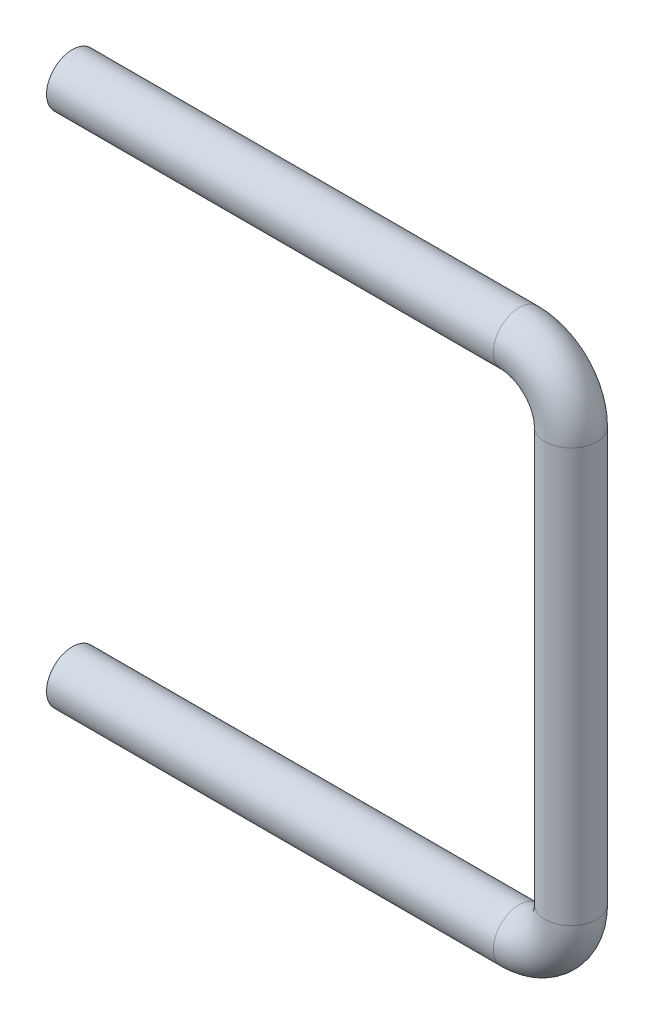
ISO-10303-21;
HEADER;
FILE_DESCRIPTION(('STEP AP214'),'2;1');
FILE_NAME('part.step','',(''),(''),'','','');
FILE_SCHEMA(('AUTOMOTIVE_DESIGN { 1 0 10303 214 1 1 1 1 }'));
ENDSEC;
DATA;
#1=APPLICATION_CONTEXT('core data for automotive mechanical design processes');
#2=APPLICATION_PROTOCOL_DEFINITION('international standard','automotive_design',2000,#1);
#3=PRODUCT_CONTEXT('',#1,'mechanical');
#4=PRODUCT('Part','Part','',(#3));
#5=PRODUCT_RELATED_PRODUCT_CATEGORY('part','',(#4));
#6=PRODUCT_DEFINITION_FORMATION('','',#4);
#7=PRODUCT_DEFINITION_CONTEXT('part definition',#1,'design');
#8=PRODUCT_DEFINITION('design','',#6,#7);
#9=PRODUCT_DEFINITION_SHAPE('','',#8);
#10=(LENGTH_UNIT() NAMED_UNIT(*) SI_UNIT(.MILLI.,.METRE.));
#11=(NAMED_UNIT(*) PLANE_ANGLE_UNIT() SI_UNIT($,.RADIAN.));
#12=(NAMED_UNIT(*) SI_UNIT($,.STERADIAN.) SOLID_ANGLE_UNIT());
#13=UNCERTAINTY_MEASURE_WITH_UNIT(LENGTH_MEASURE(1.E-05),#10,'distance_accuracy_value','');
#14=(GEOMETRIC_REPRESENTATION_CONTEXT(3) GLOBAL_UNCERTAINTY_ASSIGNED_CONTEXT((#13)) GLOBAL_UNIT_ASSIGNED_CONTEXT((#10,
#11,#12)) REPRESENTATION_CONTEXT('',''));
#15=CARTESIAN_POINT('',(0.,0.,0.));
#16=DIRECTION('',(0.,0.,1.));
#17=DIRECTION('',(1.,0.,0.));
#18=AXIS2_PLACEMENT_3D('',#15,#16,#17);
#19=CARTESIAN_POINT('',(0.,-50.,0.));
#20=DIRECTION('',(1.,0.,0.));
#21=DIRECTION('',(0.,0.,-1.));
#22=AXIS2_PLACEMENT_3D('',#19,#20,#21);
#23=PLANE('',#22);
#24=CARTESIAN_POINT('',(0.,-50.,0.));
#25=DIRECTION('',(1.,0.,0.));
#26=DIRECTION('',(0.,0.,-1.));
#27=AXIS2_PLACEMENT_3D('',#24,#25,#26);
#28=CIRCLE('',#27,5.);
#29=CARTESIAN_POINT('',(0.,-50.,-5.));
#30=VERTEX_POINT('',#29);
#31=EDGE_CURVE('E69',#30,#30,#28,.T.);
#32=ORIENTED_EDGE('',*,*,#31,.F.);
#33=EDGE_LOOP('',(#32));
#34=FACE_BOUND('',#33,.T.);
#35=ADVANCED_FACE('F47',(#34),#23,.F.);
#36=CARTESIAN_POINT('',(0.,50.,0.));
#37=DIRECTION('',(-1.,0.,0.));
#38=DIRECTION('',(0.,0.,-1.));
#39=AXIS2_PLACEMENT_3D('',#36,#37,#38);
#40=PLANE('',#39);
#41=CARTESIAN_POINT('',(0.,50.,0.));
#42=DIRECTION('',(-1.,0.,0.));
#43=DIRECTION('',(0.,0.,-1.));
#44=AXIS2_PLACEMENT_3D('',#41,#42,#43);
#45=CIRCLE('',#44,5.);
#46=CARTESIAN_POINT('',(0.,50.,-5.));
#47=VERTEX_POINT('',#46);
#48=EDGE_CURVE('E11',#47,#47,#45,.T.);
#49=ORIENTED_EDGE('',*,*,#48,.T.);
#50=EDGE_LOOP('',(#49));
#51=FACE_BOUND('',#50,.T.);
#52=ADVANCED_FACE('F76',(#51),#40,.T.);
#53=CARTESIAN_POINT('',(0.,-50.,0.));
#54=DIRECTION('',(1.,0.,0.));
#55=DIRECTION('',(0.,0.,-1.));
#56=AXIS2_PLACEMENT_3D('',#53,#54,#55);
#57=CYLINDRICAL_SURFACE('',#56,5.);
#58=CARTESIAN_POINT('',(86.4163822525597,-50.,0.));
#59=DIRECTION('',(1.,0.,0.));
#60=DIRECTION('',(0.,0.,-1.));
#61=AXIS2_PLACEMENT_3D('',#58,#59,#60);
#62=CIRCLE('',#61,5.);
#63=CARTESIAN_POINT('',(86.4163822525596,-55.,0.));
#64=VERTEX_POINT('',#63);
#65=EDGE_CURVE('E66',#64,#64,#62,.T.);
#66=ORIENTED_EDGE('',*,*,#65,.F.);
#67=EDGE_LOOP('',(#66));
#68=FACE_BOUND('',#67,.T.);
#69=ORIENTED_EDGE('',*,*,#31,.T.);
#70=EDGE_LOOP('',(#69));
#71=FACE_BOUND('',#70,.T.);
#72=ADVANCED_FACE('F73',(#68,#71),#57,.T.);
#73=CARTESIAN_POINT('',(86.4163822525597,-40.,0.));
#74=DIRECTION('',(0.,0.,1.));
#75=DIRECTION('',(1.,0.,0.));
#76=AXIS2_PLACEMENT_3D('',#73,#74,#75);
#77=TOROIDAL_SURFACE('',#76,9.99999999999999,5.);
#78=CARTESIAN_POINT('',(96.4163822525597,-40.,0.));
#79=DIRECTION('',(0.,1.,0.));
#80=DIRECTION('',(0.,0.,-1.));
#81=AXIS2_PLACEMENT_3D('',#78,#79,#80);
#82=CIRCLE('',#81,5.);
#83=CARTESIAN_POINT('',(101.41638225256,-40.,0.));
#84=VERTEX_POINT('',#83);
#85=EDGE_CURVE('E61',#84,#84,#82,.T.);
#86=CARTESIAN_POINT('',(86.4163822525597,-40.,0.));
#87=DIRECTION('',(0.,0.,1.));
#88=DIRECTION('',(1.,0.,0.));
#89=AXIS2_PLACEMENT_3D('',#86,#87,#88);
#90=CIRCLE('',#89,15.);
#91=EDGE_CURVE('',#64,#84,#90,.T.);
#92=ORIENTED_EDGE('',*,*,#65,.T.);
#93=ORIENTED_EDGE('',*,*,#85,.F.);
#94=ORIENTED_EDGE('',*,*,#91,.T.);
#95=ORIENTED_EDGE('',*,*,#91,.F.);
#96=EDGE_LOOP('',(#92,#94,#93,#95));
#97=FACE_BOUND('',#96,.T.);
#98=ADVANCED_FACE('F94',(#97),#77,.T.);
#99=CARTESIAN_POINT('',(96.4163822525597,-39.9999999999999,0.));
#100=DIRECTION('',(0.,1.,0.));
#101=DIRECTION('',(0.,0.,1.));
#102=AXIS2_PLACEMENT_3D('',#99,#100,#101);
#103=CYLINDRICAL_SURFACE('',#102,5.);
#104=CARTESIAN_POINT('',(96.4163822525597,39.9999999999999,0.));
#105=DIRECTION('',(0.,1.,0.));
#106=DIRECTION('',(0.,0.,-1.));
#107=AXIS2_PLACEMENT_3D('',#104,#105,#106);
#108=CIRCLE('',#107,5.);
#109=CARTESIAN_POINT('',(101.41638225256,39.9999999999999,0.));
#110=VERTEX_POINT('',#109);
#111=EDGE_CURVE('E57',#110,#110,#108,.T.);
#112=ORIENTED_EDGE('',*,*,#111,.F.);
#113=EDGE_LOOP('',(#112));
#114=FACE_BOUND('',#113,.T.);
#115=ORIENTED_EDGE('',*,*,#85,.T.);
#116=EDGE_LOOP('',(#115));
#117=FACE_BOUND('',#116,.T.);
#118=ADVANCED_FACE('F88',(#114,#117),#103,.T.);
#119=CARTESIAN_POINT('',(86.4163822525597,40.,0.));
#120=DIRECTION('',(0.,0.,1.));
#121=DIRECTION('',(1.,0.,0.));
#122=AXIS2_PLACEMENT_3D('',#119,#120,#121);
#123=TOROIDAL_SURFACE('',#122,9.99999999999999,5.);
#124=CARTESIAN_POINT('',(86.4163822525597,50.,0.));
#125=DIRECTION('',(-1.,0.,0.));
#126=DIRECTION('',(0.,0.,-1.));
#127=AXIS2_PLACEMENT_3D('',#124,#125,#126);
#128=CIRCLE('',#127,5.);
#129=CARTESIAN_POINT('',(86.4163822525596,55.,0.));
#130=VERTEX_POINT('',#129);
#131=EDGE_CURVE('E53',#130,#130,#128,.T.);
#132=CARTESIAN_POINT('',(86.4163822525597,40.,0.));
#133=DIRECTION('',(0.,0.,1.));
#134=DIRECTION('',(1.,0.,0.));
#135=AXIS2_PLACEMENT_3D('',#132,#133,#134);
#136=CIRCLE('',#135,15.);
#137=EDGE_CURVE('',#110,#130,#136,.T.);
#138=ORIENTED_EDGE('',*,*,#111,.T.);
#139=ORIENTED_EDGE('',*,*,#131,.F.);
#140=ORIENTED_EDGE('',*,*,#137,.T.);
#141=ORIENTED_EDGE('',*,*,#137,.F.);
#142=EDGE_LOOP('',(#138,#140,#139,#141));
#143=FACE_BOUND('',#142,.T.);
#144=ADVANCED_FACE('F82',(#143),#123,.T.);
#145=CARTESIAN_POINT('',(86.4163822525597,50.,0.));
#146=DIRECTION('',(-1.,0.,0.));
#147=DIRECTION('',(0.,0.,1.));
#148=AXIS2_PLACEMENT_3D('',#145,#146,#147);
#149=CYLINDRICAL_SURFACE('',#148,5.);
#150=ORIENTED_EDGE('',*,*,#48,.F.);
#151=EDGE_LOOP('',(#150));
#152=FACE_BOUND('',#151,.T.);
#153=ORIENTED_EDGE('',*,*,#131,.T.);
#154=EDGE_LOOP('',(#153));
#155=FACE_BOUND('',#154,.T.);
#156=ADVANCED_FACE('F80',(#152,#155),#149,.T.);
#157=CLOSED_SHELL('',(#35,#52,#72,#98,#118,#144,#156));
#158=MANIFOLD_SOLID_BREP('B2',#157);
#159=ADVANCED_BREP_SHAPE_REPRESENTATION('',(#18,#158),#14);
#160=SHAPE_DEFINITION_REPRESENTATION(#9,#159);
ENDSEC;
END-ISO-10303-21;
